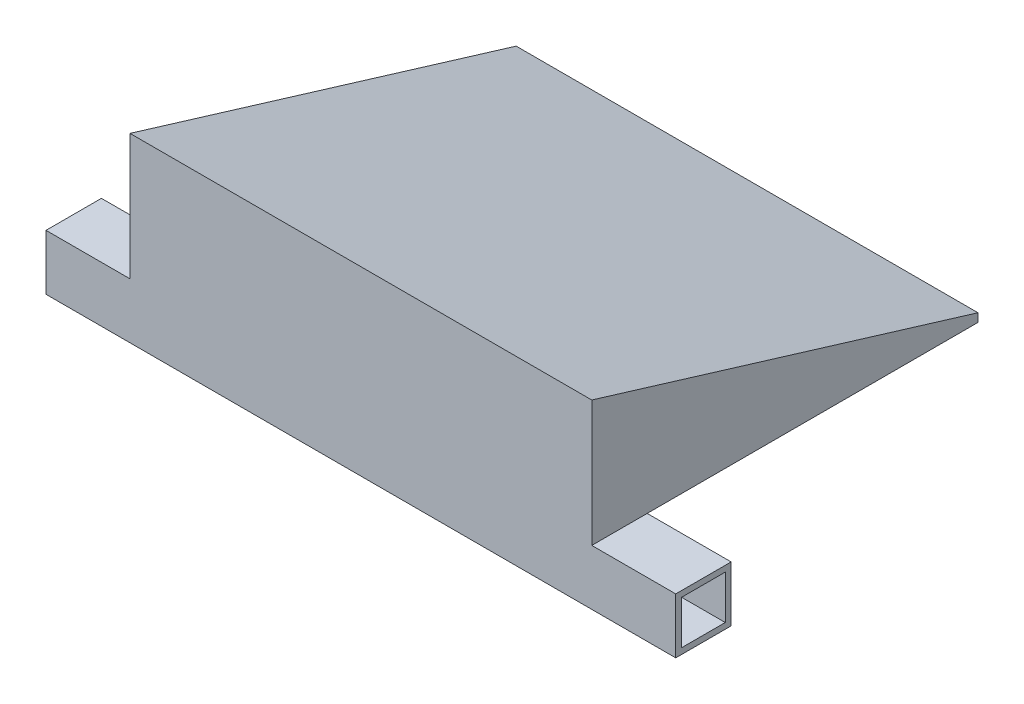
ISO-10303-21;
HEADER;
FILE_DESCRIPTION(('STEP AP214'),'2;1');
FILE_NAME('part.step','',(''),(''),'','','');
FILE_SCHEMA(('AUTOMOTIVE_DESIGN { 1 0 10303 214 1 1 1 1 }'));
ENDSEC;
DATA;
#1=APPLICATION_CONTEXT('core data for automotive mechanical design processes');
#2=APPLICATION_PROTOCOL_DEFINITION('international standard','automotive_design',2000,#1);
#3=PRODUCT_CONTEXT('',#1,'mechanical');
#4=PRODUCT('Part','Part','',(#3));
#5=PRODUCT_RELATED_PRODUCT_CATEGORY('part','',(#4));
#6=PRODUCT_DEFINITION_FORMATION('','',#4);
#7=PRODUCT_DEFINITION_CONTEXT('part definition',#1,'design');
#8=PRODUCT_DEFINITION('design','',#6,#7);
#9=PRODUCT_DEFINITION_SHAPE('','',#8);
#10=(LENGTH_UNIT() NAMED_UNIT(*) SI_UNIT(.MILLI.,.METRE.));
#11=(NAMED_UNIT(*) PLANE_ANGLE_UNIT() SI_UNIT($,.RADIAN.));
#12=(NAMED_UNIT(*) SI_UNIT($,.STERADIAN.) SOLID_ANGLE_UNIT());
#13=UNCERTAINTY_MEASURE_WITH_UNIT(LENGTH_MEASURE(1.E-05),#10,'distance_accuracy_value','');
#14=(GEOMETRIC_REPRESENTATION_CONTEXT(3) GLOBAL_UNCERTAINTY_ASSIGNED_CONTEXT((#13)) GLOBAL_UNIT_ASSIGNED_CONTEXT((#10,
#11,#12)) REPRESENTATION_CONTEXT('',''));
#15=CARTESIAN_POINT('',(0.,0.,0.));
#16=DIRECTION('',(0.,0.,1.));
#17=DIRECTION('',(1.,0.,0.));
#18=AXIS2_PLACEMENT_3D('',#15,#16,#17);
#19=CARTESIAN_POINT('',(187.5,-16.5,33.));
#20=DIRECTION('',(-1.,0.,0.));
#21=DIRECTION('',(0.,0.,1.));
#22=AXIS2_PLACEMENT_3D('',#19,#20,#21);
#23=PLANE('',#22);
#24=DIRECTION('',(0.,1.,0.));
#25=VECTOR('',#24,1.);
#26=CARTESIAN_POINT('',(187.5,-16.5,0.));
#27=LINE('',#26,#25);
#28=CARTESIAN_POINT('',(187.5,-16.5,0.));
#29=VERTEX_POINT('',#28);
#30=CARTESIAN_POINT('',(187.5,16.5,0.));
#31=VERTEX_POINT('',#30);
#32=EDGE_CURVE('E271',#29,#31,#27,.T.);
#33=ORIENTED_EDGE('',*,*,#32,.T.);
#34=DIRECTION('',(0.,0.,-1.));
#35=VECTOR('',#34,1.);
#36=CARTESIAN_POINT('',(187.5,16.5,33.));
#37=LINE('',#36,#35);
#38=CARTESIAN_POINT('',(187.5,16.5,33.));
#39=VERTEX_POINT('',#38);
#40=EDGE_CURVE('E302',#39,#31,#37,.T.);
#41=ORIENTED_EDGE('',*,*,#40,.F.);
#42=DIRECTION('',(0.,1.,0.));
#43=VECTOR('',#42,1.);
#44=CARTESIAN_POINT('',(187.5,-16.5,33.));
#45=LINE('',#44,#43);
#46=CARTESIAN_POINT('',(187.5,-16.5,33.));
#47=VERTEX_POINT('',#46);
#48=EDGE_CURVE('E272',#47,#39,#45,.T.);
#49=ORIENTED_EDGE('',*,*,#48,.F.);
#50=DIRECTION('',(0.,0.,-1.));
#51=VECTOR('',#50,1.);
#52=CARTESIAN_POINT('',(187.5,-16.5,33.));
#53=LINE('',#52,#51);
#54=EDGE_CURVE('E284',#47,#29,#53,.T.);
#55=ORIENTED_EDGE('',*,*,#54,.T.);
#56=EDGE_LOOP('',(#33,#41,#49,#55));
#57=FACE_BOUND('',#56,.T.);
#58=DIRECTION('',(0.,1.,0.));
#59=VECTOR('',#58,1.);
#60=CARTESIAN_POINT('',(187.5,0.,3.5));
#61=LINE('',#60,#59);
#62=CARTESIAN_POINT('',(187.5,-13.,3.5));
#63=VERTEX_POINT('',#62);
#64=CARTESIAN_POINT('',(187.5,13.,3.5));
#65=VERTEX_POINT('',#64);
#66=EDGE_CURVE('E195',#63,#65,#61,.T.);
#67=ORIENTED_EDGE('',*,*,#66,.F.);
#68=DIRECTION('',(0.,0.,-1.));
#69=VECTOR('',#68,1.);
#70=CARTESIAN_POINT('',(187.5,-13.,33.));
#71=LINE('',#70,#69);
#72=CARTESIAN_POINT('',(187.5,-13.,29.5));
#73=VERTEX_POINT('',#72);
#74=EDGE_CURVE('E205',#73,#63,#71,.T.);
#75=ORIENTED_EDGE('',*,*,#74,.F.);
#76=DIRECTION('',(0.,1.,0.));
#77=VECTOR('',#76,1.);
#78=CARTESIAN_POINT('',(187.5,0.,29.5));
#79=LINE('',#78,#77);
#80=CARTESIAN_POINT('',(187.5,13.,29.5));
#81=VERTEX_POINT('',#80);
#82=EDGE_CURVE('E61',#73,#81,#79,.T.);
#83=ORIENTED_EDGE('',*,*,#82,.T.);
#84=DIRECTION('',(0.,0.,-1.));
#85=VECTOR('',#84,1.);
#86=CARTESIAN_POINT('',(187.5,13.,33.));
#87=LINE('',#86,#85);
#88=EDGE_CURVE('E208',#81,#65,#87,.T.);
#89=ORIENTED_EDGE('',*,*,#88,.T.);
#90=EDGE_LOOP('',(#67,#75,#83,#89));
#91=FACE_BOUND('',#90,.T.);
#92=ADVANCED_FACE('F45',(#57,#91),#23,.F.);
#93=CARTESIAN_POINT('',(-187.5,-16.5,33.));
#94=DIRECTION('',(1.,0.,0.));
#95=DIRECTION('',(0.,0.,-1.));
#96=AXIS2_PLACEMENT_3D('',#93,#94,#95);
#97=PLANE('',#96);
#98=DIRECTION('',(0.,-1.,0.));
#99=VECTOR('',#98,1.);
#100=CARTESIAN_POINT('',(-187.5,-16.5,0.));
#101=LINE('',#100,#99);
#102=CARTESIAN_POINT('',(-187.5,16.5,0.));
#103=VERTEX_POINT('',#102);
#104=CARTESIAN_POINT('',(-187.5,-16.5,0.));
#105=VERTEX_POINT('',#104);
#106=EDGE_CURVE('E290',#103,#105,#101,.T.);
#107=ORIENTED_EDGE('',*,*,#106,.T.);
#108=DIRECTION('',(0.,0.,-1.));
#109=VECTOR('',#108,1.);
#110=CARTESIAN_POINT('',(-187.5,-16.5,33.));
#111=LINE('',#110,#109);
#112=CARTESIAN_POINT('',(-187.5,-16.5,33.));
#113=VERTEX_POINT('',#112);
#114=EDGE_CURVE('E296',#113,#105,#111,.T.);
#115=ORIENTED_EDGE('',*,*,#114,.F.);
#116=DIRECTION('',(0.,-1.,0.));
#117=VECTOR('',#116,1.);
#118=CARTESIAN_POINT('',(-187.5,-16.5,33.));
#119=LINE('',#118,#117);
#120=CARTESIAN_POINT('',(-187.5,16.5,33.));
#121=VERTEX_POINT('',#120);
#122=EDGE_CURVE('E280',#121,#113,#119,.T.);
#123=ORIENTED_EDGE('',*,*,#122,.F.);
#124=DIRECTION('',(0.,0.,-1.));
#125=VECTOR('',#124,1.);
#126=CARTESIAN_POINT('',(-187.5,16.5,33.));
#127=LINE('',#126,#125);
#128=EDGE_CURVE('E299',#121,#103,#127,.T.);
#129=ORIENTED_EDGE('',*,*,#128,.T.);
#130=EDGE_LOOP('',(#107,#115,#123,#129));
#131=FACE_BOUND('',#130,.T.);
#132=DIRECTION('',(0.,-1.,0.));
#133=VECTOR('',#132,1.);
#134=CARTESIAN_POINT('',(-187.5,0.,3.5));
#135=LINE('',#134,#133);
#136=CARTESIAN_POINT('',(-187.5,13.,3.5));
#137=VERTEX_POINT('',#136);
#138=CARTESIAN_POINT('',(-187.5,-13.,3.5));
#139=VERTEX_POINT('',#138);
#140=EDGE_CURVE('E214',#137,#139,#135,.T.);
#141=ORIENTED_EDGE('',*,*,#140,.F.);
#142=DIRECTION('',(0.,0.,-1.));
#143=VECTOR('',#142,1.);
#144=CARTESIAN_POINT('',(-187.5,13.,33.));
#145=LINE('',#144,#143);
#146=CARTESIAN_POINT('',(-187.5,13.,29.5));
#147=VERTEX_POINT('',#146);
#148=EDGE_CURVE('E239',#147,#137,#145,.T.);
#149=ORIENTED_EDGE('',*,*,#148,.F.);
#150=DIRECTION('',(0.,-1.,0.));
#151=VECTOR('',#150,1.);
#152=CARTESIAN_POINT('',(-187.5,0.,29.5));
#153=LINE('',#152,#151);
#154=CARTESIAN_POINT('',(-187.5,-13.,29.5));
#155=VERTEX_POINT('',#154);
#156=EDGE_CURVE('E67',#147,#155,#153,.T.);
#157=ORIENTED_EDGE('',*,*,#156,.T.);
#158=DIRECTION('',(0.,0.,-1.));
#159=VECTOR('',#158,1.);
#160=CARTESIAN_POINT('',(-187.5,-13.,33.));
#161=LINE('',#160,#159);
#162=EDGE_CURVE('E234',#155,#139,#161,.T.);
#163=ORIENTED_EDGE('',*,*,#162,.T.);
#164=EDGE_LOOP('',(#141,#149,#157,#163));
#165=FACE_BOUND('',#164,.T.);
#166=ADVANCED_FACE('F343',(#131,#165),#97,.F.);
#167=CARTESIAN_POINT('',(0.,91.5,33.));
#168=DIRECTION('',(0.,-0.956673880428858,0.291161615782696));
#169=DIRECTION('',(-1.,0.,0.));
#170=AXIS2_PLACEMENT_3D('',#167,#168,#169);
#171=PLANE('',#170);
#172=DIRECTION('',(1.,0.,0.));
#173=VECTOR('',#172,1.);
#174=CARTESIAN_POINT('',(-137.49993505978,91.5,33.));
#175=LINE('',#174,#173);
#176=CARTESIAN_POINT('',(-137.49993505978,91.5,33.));
#177=VERTEX_POINT('',#176);
#178=CARTESIAN_POINT('',(137.50006494022,91.5,33.));
#179=VERTEX_POINT('',#178);
#180=EDGE_CURVE('E248',#177,#179,#175,.T.);
#181=ORIENTED_EDGE('',*,*,#180,.T.);
#182=DIRECTION('',(0.,-0.291161615782696,-0.956673880428859));
#183=VECTOR('',#182,1.);
#184=CARTESIAN_POINT('',(137.50006494022,91.5,33.));
#185=LINE('',#184,#183);
#186=CARTESIAN_POINT('',(137.50006494022,21.5,-197.));
#187=VERTEX_POINT('',#186);
#188=EDGE_CURVE('E54',#187,#179,#185,.F.);
#189=ORIENTED_EDGE('',*,*,#188,.F.);
#190=DIRECTION('',(1.,0.,0.));
#191=VECTOR('',#190,1.);
#192=CARTESIAN_POINT('',(-137.49993505978,21.5,-197.));
#193=LINE('',#192,#191);
#194=CARTESIAN_POINT('',(-137.49993505978,21.5,-197.));
#195=VERTEX_POINT('',#194);
#196=EDGE_CURVE('E305',#195,#187,#193,.T.);
#197=ORIENTED_EDGE('',*,*,#196,.F.);
#198=DIRECTION('',(0.,0.291161615782696,0.956673880428859));
#199=VECTOR('',#198,1.);
#200=CARTESIAN_POINT('',(-137.49993505978,91.5,33.));
#201=LINE('',#200,#199);
#202=EDGE_CURVE('E13',#177,#195,#201,.F.);
#203=ORIENTED_EDGE('',*,*,#202,.F.);
#204=EDGE_LOOP('',(#181,#189,#197,#203));
#205=FACE_BOUND('',#204,.T.);
#206=ADVANCED_FACE('F48',(#205),#171,.F.);
#207=CARTESIAN_POINT('',(-187.5,16.5,33.));
#208=DIRECTION('',(0.,-1.,0.));
#209=DIRECTION('',(0.,0.,-1.));
#210=AXIS2_PLACEMENT_3D('',#207,#208,#209);
#211=PLANE('',#210);
#212=DIRECTION('',(0.,0.,1.));
#213=VECTOR('',#212,1.);
#214=CARTESIAN_POINT('',(-137.49993505978,16.5,33.));
#215=LINE('',#214,#213);
#216=CARTESIAN_POINT('',(-137.49993505978,16.5,0.));
#217=VERTEX_POINT('',#216);
#218=CARTESIAN_POINT('',(-137.49993505978,16.5,33.));
#219=VERTEX_POINT('',#218);
#220=EDGE_CURVE('E256',#217,#219,#215,.T.);
#221=ORIENTED_EDGE('',*,*,#220,.F.);
#222=DIRECTION('',(-1.,0.,0.));
#223=VECTOR('',#222,1.);
#224=CARTESIAN_POINT('',(-187.5,16.5,0.));
#225=LINE('',#224,#223);
#226=EDGE_CURVE('E287',#217,#103,#225,.T.);
#227=ORIENTED_EDGE('',*,*,#226,.T.);
#228=ORIENTED_EDGE('',*,*,#128,.F.);
#229=DIRECTION('',(-1.,0.,0.));
#230=VECTOR('',#229,1.);
#231=CARTESIAN_POINT('',(-187.5,16.5,33.));
#232=LINE('',#231,#230);
#233=EDGE_CURVE('E275',#219,#121,#232,.T.);
#234=ORIENTED_EDGE('',*,*,#233,.F.);
#235=EDGE_LOOP('',(#221,#227,#228,#234));
#236=FACE_BOUND('',#235,.T.);
#237=ADVANCED_FACE('F339',(#236),#211,.F.);
#238=DIRECTION('',(0.,0.,-1.));
#239=VECTOR('',#238,1.);
#240=CARTESIAN_POINT('',(137.50006494022,16.5,33.));
#241=LINE('',#240,#239);
#242=CARTESIAN_POINT('',(137.50006494022,16.5,33.));
#243=VERTEX_POINT('',#242);
#244=CARTESIAN_POINT('',(137.50006494022,16.5,0.));
#245=VERTEX_POINT('',#244);
#246=EDGE_CURVE('E257',#243,#245,#241,.T.);
#247=ORIENTED_EDGE('',*,*,#246,.F.);
#248=EDGE_CURVE('E277',#39,#243,#232,.T.);
#249=ORIENTED_EDGE('',*,*,#248,.F.);
#250=ORIENTED_EDGE('',*,*,#40,.T.);
#251=EDGE_CURVE('E288',#31,#245,#225,.T.);
#252=ORIENTED_EDGE('',*,*,#251,.T.);
#253=EDGE_LOOP('',(#247,#249,#250,#252));
#254=FACE_BOUND('',#253,.T.);
#255=ADVANCED_FACE('F321',(#254),#211,.F.);
#256=CARTESIAN_POINT('',(-187.5,-16.5,33.));
#257=DIRECTION('',(0.,1.,0.));
#258=DIRECTION('',(0.,0.,1.));
#259=AXIS2_PLACEMENT_3D('',#256,#257,#258);
#260=PLANE('',#259);
#261=DIRECTION('',(1.,0.,0.));
#262=VECTOR('',#261,1.);
#263=CARTESIAN_POINT('',(-187.5,-16.5,0.));
#264=LINE('',#263,#262);
#265=EDGE_CURVE('E276',#105,#29,#264,.T.);
#266=ORIENTED_EDGE('',*,*,#265,.T.);
#267=ORIENTED_EDGE('',*,*,#54,.F.);
#268=DIRECTION('',(1.,0.,0.));
#269=VECTOR('',#268,1.);
#270=CARTESIAN_POINT('',(-187.5,-16.5,33.));
#271=LINE('',#270,#269);
#272=EDGE_CURVE('E282',#113,#47,#271,.T.);
#273=ORIENTED_EDGE('',*,*,#272,.F.);
#274=ORIENTED_EDGE('',*,*,#114,.T.);
#275=EDGE_LOOP('',(#266,#267,#273,#274));
#276=FACE_BOUND('',#275,.T.);
#277=ADVANCED_FACE('F349',(#276),#260,.F.);
#278=CARTESIAN_POINT('',(0.,0.,33.));
#279=DIRECTION('',(0.,0.,-1.));
#280=DIRECTION('',(-1.,0.,0.));
#281=AXIS2_PLACEMENT_3D('',#278,#279,#280);
#282=PLANE('',#281);
#283=ORIENTED_EDGE('',*,*,#48,.T.);
#284=ORIENTED_EDGE('',*,*,#248,.T.);
#285=DIRECTION('',(0.,-1.,0.));
#286=VECTOR('',#285,1.);
#287=CARTESIAN_POINT('',(137.50006494022,91.5,33.));
#288=LINE('',#287,#286);
#289=EDGE_CURVE('E265',#179,#243,#288,.T.);
#290=ORIENTED_EDGE('',*,*,#289,.F.);
#291=ORIENTED_EDGE('',*,*,#180,.F.);
#292=DIRECTION('',(0.,-1.,0.));
#293=VECTOR('',#292,1.);
#294=CARTESIAN_POINT('',(-137.49993505978,91.5,33.));
#295=LINE('',#294,#293);
#296=EDGE_CURVE('E268',#177,#219,#295,.T.);
#297=ORIENTED_EDGE('',*,*,#296,.T.);
#298=ORIENTED_EDGE('',*,*,#233,.T.);
#299=ORIENTED_EDGE('',*,*,#122,.T.);
#300=ORIENTED_EDGE('',*,*,#272,.T.);
#301=EDGE_LOOP('',(#283,#284,#290,#291,#297,#298,#299,#300));
#302=FACE_BOUND('',#301,.T.);
#303=ADVANCED_FACE('F317',(#302),#282,.F.);
#304=CARTESIAN_POINT('',(0.,0.,0.));
#305=DIRECTION('',(0.,0.,-1.));
#306=DIRECTION('',(-1.,0.,0.));
#307=AXIS2_PLACEMENT_3D('',#304,#305,#306);
#308=PLANE('',#307);
#309=ORIENTED_EDGE('',*,*,#32,.F.);
#310=ORIENTED_EDGE('',*,*,#265,.F.);
#311=ORIENTED_EDGE('',*,*,#106,.F.);
#312=ORIENTED_EDGE('',*,*,#226,.F.);
#313=EDGE_CURVE('E291',#245,#217,#225,.T.);
#314=ORIENTED_EDGE('',*,*,#313,.F.);
#315=ORIENTED_EDGE('',*,*,#251,.F.);
#316=EDGE_LOOP('',(#309,#310,#311,#312,#314,#315));
#317=FACE_BOUND('',#316,.T.);
#318=ADVANCED_FACE('F354',(#317),#308,.T.);
#319=CARTESIAN_POINT('',(-137.49993505978,91.5,33.));
#320=DIRECTION('',(1.,0.,0.));
#321=DIRECTION('',(0.,0.,-1.));
#322=AXIS2_PLACEMENT_3D('',#319,#320,#321);
#323=PLANE('',#322);
#324=ORIENTED_EDGE('',*,*,#296,.F.);
#325=ORIENTED_EDGE('',*,*,#202,.T.);
#326=DIRECTION('',(0.,-1.,0.));
#327=VECTOR('',#326,1.);
#328=CARTESIAN_POINT('',(-137.49993505978,91.5,-197.));
#329=LINE('',#328,#327);
#330=CARTESIAN_POINT('',(-137.49993505978,16.5,-197.));
#331=VERTEX_POINT('',#330);
#332=EDGE_CURVE('E251',#195,#331,#329,.T.);
#333=ORIENTED_EDGE('',*,*,#332,.T.);
#334=EDGE_CURVE('E247',#331,#217,#215,.T.);
#335=ORIENTED_EDGE('',*,*,#334,.T.);
#336=ORIENTED_EDGE('',*,*,#220,.T.);
#337=EDGE_LOOP('',(#324,#325,#333,#335,#336));
#338=FACE_BOUND('',#337,.T.);
#339=ADVANCED_FACE('F333',(#338),#323,.F.);
#340=CARTESIAN_POINT('',(137.50006494022,91.5,33.));
#341=DIRECTION('',(-1.,0.,0.));
#342=DIRECTION('',(0.,0.,1.));
#343=AXIS2_PLACEMENT_3D('',#340,#341,#342);
#344=PLANE('',#343);
#345=DIRECTION('',(0.,-1.,0.));
#346=VECTOR('',#345,1.);
#347=CARTESIAN_POINT('',(137.50006494022,91.5,-197.));
#348=LINE('',#347,#346);
#349=CARTESIAN_POINT('',(137.50006494022,16.5,-197.));
#350=VERTEX_POINT('',#349);
#351=EDGE_CURVE('E263',#187,#350,#348,.T.);
#352=ORIENTED_EDGE('',*,*,#351,.F.);
#353=ORIENTED_EDGE('',*,*,#188,.T.);
#354=ORIENTED_EDGE('',*,*,#289,.T.);
#355=ORIENTED_EDGE('',*,*,#246,.T.);
#356=EDGE_CURVE('E255',#245,#350,#241,.T.);
#357=ORIENTED_EDGE('',*,*,#356,.T.);
#358=EDGE_LOOP('',(#352,#353,#354,#355,#357));
#359=FACE_BOUND('',#358,.T.);
#360=ADVANCED_FACE('F309',(#359),#344,.F.);
#361=CARTESIAN_POINT('',(-137.49993505978,91.5,-197.));
#362=DIRECTION('',(0.,0.,1.));
#363=DIRECTION('',(1.,0.,0.));
#364=AXIS2_PLACEMENT_3D('',#361,#362,#363);
#365=PLANE('',#364);
#366=ORIENTED_EDGE('',*,*,#332,.F.);
#367=ORIENTED_EDGE('',*,*,#196,.T.);
#368=ORIENTED_EDGE('',*,*,#351,.T.);
#369=DIRECTION('',(-1.,0.,0.));
#370=VECTOR('',#369,1.);
#371=CARTESIAN_POINT('',(-137.49993505978,16.5,-197.));
#372=LINE('',#371,#370);
#373=EDGE_CURVE('E252',#350,#331,#372,.T.);
#374=ORIENTED_EDGE('',*,*,#373,.T.);
#375=EDGE_LOOP('',(#366,#367,#368,#374));
#376=FACE_BOUND('',#375,.T.);
#377=ADVANCED_FACE('F331',(#376),#365,.F.);
#378=CARTESIAN_POINT('',(0.,16.5,0.));
#379=DIRECTION('',(0.,-1.,0.));
#380=DIRECTION('',(0.,0.,-1.));
#381=AXIS2_PLACEMENT_3D('',#378,#379,#380);
#382=PLANE('',#381);
#383=ORIENTED_EDGE('',*,*,#356,.F.);
#384=ORIENTED_EDGE('',*,*,#313,.T.);
#385=ORIENTED_EDGE('',*,*,#334,.F.);
#386=ORIENTED_EDGE('',*,*,#373,.F.);
#387=EDGE_LOOP('',(#383,#384,#385,#386));
#388=FACE_BOUND('',#387,.T.);
#389=ADVANCED_FACE('F328',(#388),#382,.T.);
#390=CARTESIAN_POINT('',(0.,88.151641418499,34.0190656552394));
#391=DIRECTION('',(0.,-0.956673880428858,0.291161615782696));
#392=DIRECTION('',(-1.,0.,0.));
#393=AXIS2_PLACEMENT_3D('',#390,#391,#392);
#394=PLANE('',#393);
#395=DIRECTION('',(-1.,0.,0.));
#396=VECTOR('',#395,1.);
#397=CARTESIAN_POINT('',(0.,20.,-189.9077561484));
#398=LINE('',#397,#396);
#399=CARTESIAN_POINT('',(-133.99993505978,20.,-189.9077561484));
#400=VERTEX_POINT('',#399);
#401=CARTESIAN_POINT('',(134.00006494022,20.,-189.9077561484));
#402=VERTEX_POINT('',#401);
#403=EDGE_CURVE('E176',#400,#402,#398,.F.);
#404=ORIENTED_EDGE('',*,*,#403,.T.);
#405=DIRECTION('',(0.,-0.291161615782696,-0.956673880428859));
#406=VECTOR('',#405,1.);
#407=CARTESIAN_POINT('',(134.00006494022,88.151641418499,34.0190656552394));
#408=LINE('',#407,#406);
#409=CARTESIAN_POINT('',(134.00006494022,86.7762736103826,29.5));
#410=VERTEX_POINT('',#409);
#411=EDGE_CURVE('E170',#402,#410,#408,.F.);
#412=ORIENTED_EDGE('',*,*,#411,.T.);
#413=DIRECTION('',(-1.,0.,0.));
#414=VECTOR('',#413,1.);
#415=CARTESIAN_POINT('',(0.,86.7762736103826,29.5));
#416=LINE('',#415,#414);
#417=CARTESIAN_POINT('',(-133.99993505978,86.7762736103826,29.5));
#418=VERTEX_POINT('',#417);
#419=EDGE_CURVE('E174',#418,#410,#416,.F.);
#420=ORIENTED_EDGE('',*,*,#419,.F.);
#421=DIRECTION('',(0.,0.291161615782696,0.956673880428859));
#422=VECTOR('',#421,1.);
#423=CARTESIAN_POINT('',(-133.99993505978,88.151641418499,34.0190656552394));
#424=LINE('',#423,#422);
#425=EDGE_CURVE('E181',#418,#400,#424,.F.);
#426=ORIENTED_EDGE('',*,*,#425,.T.);
#427=EDGE_LOOP('',(#404,#412,#420,#426));
#428=FACE_BOUND('',#427,.T.);
#429=ADVANCED_FACE('F172',(#428),#394,.T.);
#430=CARTESIAN_POINT('',(-187.5,13.,33.));
#431=DIRECTION('',(0.,-1.,0.));
#432=DIRECTION('',(0.,0.,-1.));
#433=AXIS2_PLACEMENT_3D('',#430,#431,#432);
#434=PLANE('',#433);
#435=DIRECTION('',(0.,0.,1.));
#436=VECTOR('',#435,1.);
#437=CARTESIAN_POINT('',(-133.99993505978,13.,33.));
#438=LINE('',#437,#436);
#439=CARTESIAN_POINT('',(-133.99993505978,13.,3.5));
#440=VERTEX_POINT('',#439);
#441=CARTESIAN_POINT('',(-133.99993505978,13.,29.5));
#442=VERTEX_POINT('',#441);
#443=EDGE_CURVE('E182',#440,#442,#438,.T.);
#444=ORIENTED_EDGE('',*,*,#443,.T.);
#445=DIRECTION('',(-1.,0.,0.));
#446=VECTOR('',#445,1.);
#447=CARTESIAN_POINT('',(0.,13.,29.5));
#448=LINE('',#447,#446);
#449=EDGE_CURVE('E201',#442,#147,#448,.T.);
#450=ORIENTED_EDGE('',*,*,#449,.T.);
#451=ORIENTED_EDGE('',*,*,#148,.T.);
#452=DIRECTION('',(-1.,0.,0.));
#453=VECTOR('',#452,1.);
#454=CARTESIAN_POINT('',(0.,13.,3.5));
#455=LINE('',#454,#453);
#456=EDGE_CURVE('E209',#440,#137,#455,.T.);
#457=ORIENTED_EDGE('',*,*,#456,.F.);
#458=EDGE_LOOP('',(#444,#450,#451,#457));
#459=FACE_BOUND('',#458,.T.);
#460=ADVANCED_FACE('F445',(#459),#434,.T.);
#461=DIRECTION('',(0.,0.,-1.));
#462=VECTOR('',#461,1.);
#463=CARTESIAN_POINT('',(134.00006494022,13.,33.));
#464=LINE('',#463,#462);
#465=CARTESIAN_POINT('',(134.00006494022,13.,29.5));
#466=VERTEX_POINT('',#465);
#467=CARTESIAN_POINT('',(134.00006494022,13.,3.5));
#468=VERTEX_POINT('',#467);
#469=EDGE_CURVE('E189',#466,#468,#464,.T.);
#470=ORIENTED_EDGE('',*,*,#469,.T.);
#471=DIRECTION('',(-1.,0.,0.));
#472=VECTOR('',#471,1.);
#473=CARTESIAN_POINT('',(0.,13.,3.5));
#474=LINE('',#473,#472);
#475=EDGE_CURVE('E217',#65,#468,#474,.T.);
#476=ORIENTED_EDGE('',*,*,#475,.F.);
#477=ORIENTED_EDGE('',*,*,#88,.F.);
#478=DIRECTION('',(-1.,0.,0.));
#479=VECTOR('',#478,1.);
#480=CARTESIAN_POINT('',(0.,13.,29.5));
#481=LINE('',#480,#479);
#482=EDGE_CURVE('E198',#81,#466,#481,.T.);
#483=ORIENTED_EDGE('',*,*,#482,.T.);
#484=EDGE_LOOP('',(#470,#476,#477,#483));
#485=FACE_BOUND('',#484,.T.);
#486=ADVANCED_FACE('F454',(#485),#434,.T.);
#487=CARTESIAN_POINT('',(-187.5,-13.,33.));
#488=DIRECTION('',(0.,1.,0.));
#489=DIRECTION('',(0.,0.,1.));
#490=AXIS2_PLACEMENT_3D('',#487,#488,#489);
#491=PLANE('',#490);
#492=DIRECTION('',(1.,0.,0.));
#493=VECTOR('',#492,1.);
#494=CARTESIAN_POINT('',(0.,-13.,3.5));
#495=LINE('',#494,#493);
#496=EDGE_CURVE('E212',#139,#63,#495,.T.);
#497=ORIENTED_EDGE('',*,*,#496,.F.);
#498=ORIENTED_EDGE('',*,*,#162,.F.);
#499=DIRECTION('',(1.,0.,0.));
#500=VECTOR('',#499,1.);
#501=CARTESIAN_POINT('',(0.,-13.,29.5));
#502=LINE('',#501,#500);
#503=EDGE_CURVE('E203',#155,#73,#502,.T.);
#504=ORIENTED_EDGE('',*,*,#503,.T.);
#505=ORIENTED_EDGE('',*,*,#74,.T.);
#506=EDGE_LOOP('',(#497,#498,#504,#505));
#507=FACE_BOUND('',#506,.T.);
#508=ADVANCED_FACE('F464',(#507),#491,.T.);
#509=CARTESIAN_POINT('',(0.,0.,29.5));
#510=DIRECTION('',(0.,0.,-1.));
#511=DIRECTION('',(-1.,0.,0.));
#512=AXIS2_PLACEMENT_3D('',#509,#510,#511);
#513=PLANE('',#512);
#514=ORIENTED_EDGE('',*,*,#82,.F.);
#515=ORIENTED_EDGE('',*,*,#503,.F.);
#516=ORIENTED_EDGE('',*,*,#156,.F.);
#517=ORIENTED_EDGE('',*,*,#449,.F.);
#518=DIRECTION('',(0.,-1.,0.));
#519=VECTOR('',#518,1.);
#520=CARTESIAN_POINT('',(-133.99993505978,0.,29.5));
#521=LINE('',#520,#519);
#522=EDGE_CURVE('E188',#418,#442,#521,.T.);
#523=ORIENTED_EDGE('',*,*,#522,.F.);
#524=ORIENTED_EDGE('',*,*,#419,.T.);
#525=DIRECTION('',(0.,-1.,0.));
#526=VECTOR('',#525,1.);
#527=CARTESIAN_POINT('',(134.00006494022,91.5,29.5));
#528=LINE('',#527,#526);
#529=EDGE_CURVE('E186',#410,#466,#528,.T.);
#530=ORIENTED_EDGE('',*,*,#529,.T.);
#531=ORIENTED_EDGE('',*,*,#482,.F.);
#532=EDGE_LOOP('',(#514,#515,#516,#517,#523,#524,#530,#531));
#533=FACE_BOUND('',#532,.T.);
#534=ADVANCED_FACE('F185',(#533),#513,.T.);
#535=CARTESIAN_POINT('',(0.,0.,3.5));
#536=DIRECTION('',(0.,0.,-1.));
#537=DIRECTION('',(-1.,0.,0.));
#538=AXIS2_PLACEMENT_3D('',#535,#536,#537);
#539=PLANE('',#538);
#540=ORIENTED_EDGE('',*,*,#66,.T.);
#541=ORIENTED_EDGE('',*,*,#475,.T.);
#542=DIRECTION('',(0.,1.,0.));
#543=VECTOR('',#542,1.);
#544=CARTESIAN_POINT('',(134.00006494022,0.,3.5));
#545=LINE('',#544,#543);
#546=CARTESIAN_POINT('',(134.00006494022,20.,3.5));
#547=VERTEX_POINT('',#546);
#548=EDGE_CURVE('E225',#468,#547,#545,.T.);
#549=ORIENTED_EDGE('',*,*,#548,.T.);
#550=DIRECTION('',(-1.,0.,0.));
#551=VECTOR('',#550,1.);
#552=CARTESIAN_POINT('',(0.,20.,3.5));
#553=LINE('',#552,#551);
#554=CARTESIAN_POINT('',(-133.99993505978,20.,3.5));
#555=VERTEX_POINT('',#554);
#556=EDGE_CURVE('E211',#547,#555,#553,.T.);
#557=ORIENTED_EDGE('',*,*,#556,.T.);
#558=DIRECTION('',(0.,1.,0.));
#559=VECTOR('',#558,1.);
#560=CARTESIAN_POINT('',(-133.99993505978,91.5,3.5));
#561=LINE('',#560,#559);
#562=EDGE_CURVE('E228',#440,#555,#561,.T.);
#563=ORIENTED_EDGE('',*,*,#562,.F.);
#564=ORIENTED_EDGE('',*,*,#456,.T.);
#565=ORIENTED_EDGE('',*,*,#140,.T.);
#566=ORIENTED_EDGE('',*,*,#496,.T.);
#567=EDGE_LOOP('',(#540,#541,#549,#557,#563,#564,#565,#566));
#568=FACE_BOUND('',#567,.T.);
#569=ADVANCED_FACE('F482',(#568),#539,.F.);
#570=CARTESIAN_POINT('',(-133.99993505978,91.5,33.));
#571=DIRECTION('',(1.,0.,0.));
#572=DIRECTION('',(0.,0.,-1.));
#573=AXIS2_PLACEMENT_3D('',#570,#571,#572);
#574=PLANE('',#573);
#575=ORIENTED_EDGE('',*,*,#522,.T.);
#576=ORIENTED_EDGE('',*,*,#443,.F.);
#577=ORIENTED_EDGE('',*,*,#562,.T.);
#578=DIRECTION('',(0.,0.,1.));
#579=VECTOR('',#578,1.);
#580=CARTESIAN_POINT('',(-133.99993505978,20.,0.));
#581=LINE('',#580,#579);
#582=EDGE_CURVE('E223',#400,#555,#581,.T.);
#583=ORIENTED_EDGE('',*,*,#582,.F.);
#584=ORIENTED_EDGE('',*,*,#425,.F.);
#585=EDGE_LOOP('',(#575,#576,#577,#583,#584));
#586=FACE_BOUND('',#585,.T.);
#587=ADVANCED_FACE('F494',(#586),#574,.T.);
#588=CARTESIAN_POINT('',(134.00006494022,91.5,33.));
#589=DIRECTION('',(-1.,0.,0.));
#590=DIRECTION('',(0.,0.,1.));
#591=AXIS2_PLACEMENT_3D('',#588,#589,#590);
#592=PLANE('',#591);
#593=DIRECTION('',(0.,0.,-1.));
#594=VECTOR('',#593,1.);
#595=CARTESIAN_POINT('',(134.00006494022,20.,0.));
#596=LINE('',#595,#594);
#597=EDGE_CURVE('E221',#547,#402,#596,.T.);
#598=ORIENTED_EDGE('',*,*,#597,.F.);
#599=ORIENTED_EDGE('',*,*,#548,.F.);
#600=ORIENTED_EDGE('',*,*,#469,.F.);
#601=ORIENTED_EDGE('',*,*,#529,.F.);
#602=ORIENTED_EDGE('',*,*,#411,.F.);
#603=EDGE_LOOP('',(#598,#599,#600,#601,#602));
#604=FACE_BOUND('',#603,.T.);
#605=ADVANCED_FACE('F191',(#604),#592,.T.);
#606=CARTESIAN_POINT('',(0.,20.,0.));
#607=DIRECTION('',(0.,-1.,0.));
#608=DIRECTION('',(0.,0.,-1.));
#609=AXIS2_PLACEMENT_3D('',#606,#607,#608);
#610=PLANE('',#609);
#611=ORIENTED_EDGE('',*,*,#582,.T.);
#612=ORIENTED_EDGE('',*,*,#556,.F.);
#613=ORIENTED_EDGE('',*,*,#597,.T.);
#614=ORIENTED_EDGE('',*,*,#403,.F.);
#615=EDGE_LOOP('',(#611,#612,#613,#614));
#616=FACE_BOUND('',#615,.T.);
#617=ADVANCED_FACE('F513',(#616),#610,.F.);
#618=CLOSED_SHELL('',(#92,#166,#206,#237,#255,#277,#303,#318,#339,#360,#377,#389,#429,#460,#486,
#508,#534,#569,#587,#605,#617));
#619=MANIFOLD_SOLID_BREP('B2',#618);
#620=ADVANCED_BREP_SHAPE_REPRESENTATION('',(#18,#619),#14);
#621=SHAPE_DEFINITION_REPRESENTATION(#9,#620);
ENDSEC;
END-ISO-10303-21;
